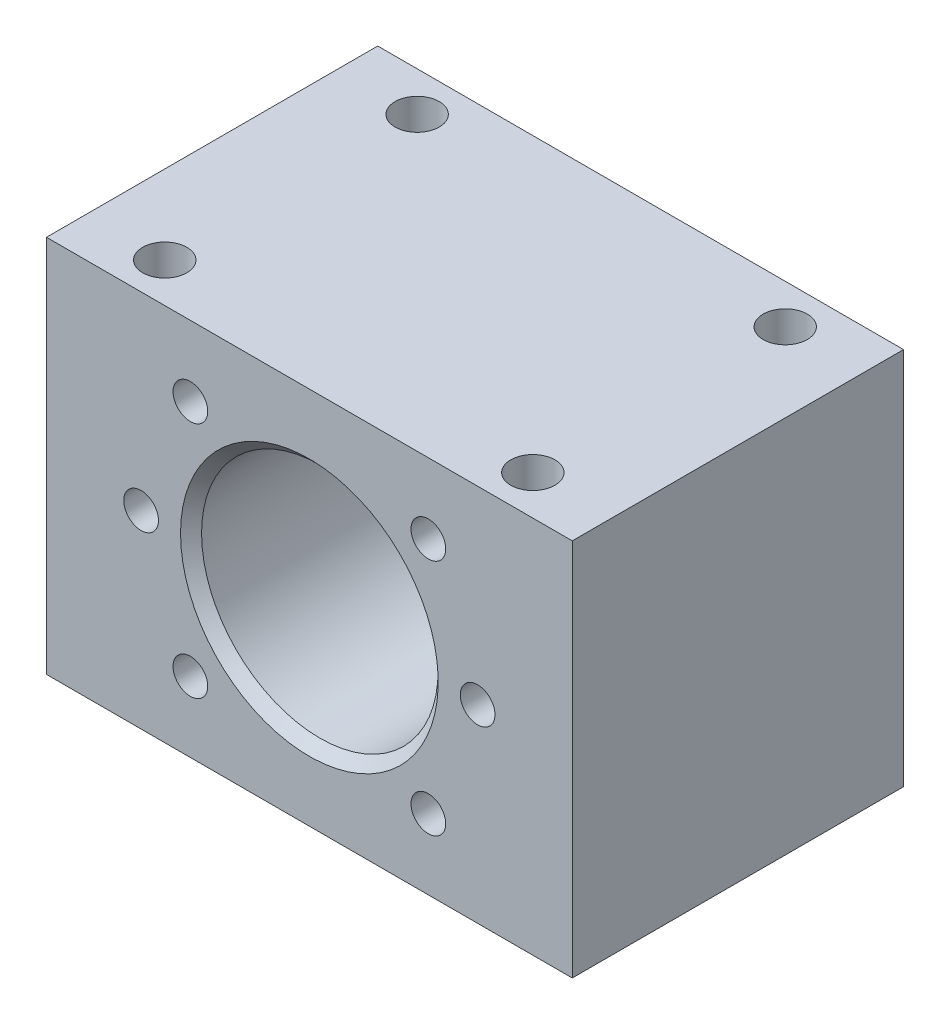
ISO-10303-21;
HEADER;
FILE_DESCRIPTION(('STEP AP214'),'2;1');
FILE_NAME('part.step','',(''),(''),'','','');
FILE_SCHEMA(('AUTOMOTIVE_DESIGN { 1 0 10303 214 1 1 1 1 }'));
ENDSEC;
DATA;
#1=APPLICATION_CONTEXT('core data for automotive mechanical design processes');
#2=APPLICATION_PROTOCOL_DEFINITION('international standard','automotive_design',2000,#1);
#3=PRODUCT_CONTEXT('',#1,'mechanical');
#4=PRODUCT('Part','Part','',(#3));
#5=PRODUCT_RELATED_PRODUCT_CATEGORY('part','',(#4));
#6=PRODUCT_DEFINITION_FORMATION('','',#4);
#7=PRODUCT_DEFINITION_CONTEXT('part definition',#1,'design');
#8=PRODUCT_DEFINITION('design','',#6,#7);
#9=PRODUCT_DEFINITION_SHAPE('','',#8);
#10=(LENGTH_UNIT() NAMED_UNIT(*) SI_UNIT(.MILLI.,.METRE.));
#11=(NAMED_UNIT(*) PLANE_ANGLE_UNIT() SI_UNIT($,.RADIAN.));
#12=(NAMED_UNIT(*) SI_UNIT($,.STERADIAN.) SOLID_ANGLE_UNIT());
#13=UNCERTAINTY_MEASURE_WITH_UNIT(LENGTH_MEASURE(1.E-05),#10,'distance_accuracy_value','');
#14=(GEOMETRIC_REPRESENTATION_CONTEXT(3) GLOBAL_UNCERTAINTY_ASSIGNED_CONTEXT((#13)) GLOBAL_UNIT_ASSIGNED_CONTEXT((#10,
#11,#12)) REPRESENTATION_CONTEXT('',''));
#15=CARTESIAN_POINT('',(0.,0.,0.));
#16=DIRECTION('',(0.,0.,1.));
#17=DIRECTION('',(1.,0.,0.));
#18=AXIS2_PLACEMENT_3D('',#15,#16,#17);
#19=CARTESIAN_POINT('',(25.,-18.,31.5));
#20=DIRECTION('',(-1.,0.,0.));
#21=DIRECTION('',(0.,0.,1.));
#22=AXIS2_PLACEMENT_3D('',#19,#20,#21);
#23=PLANE('',#22);
#24=DIRECTION('',(0.,1.,0.));
#25=VECTOR('',#24,1.);
#26=CARTESIAN_POINT('',(25.,-18.,0.));
#27=LINE('',#26,#25);
#28=CARTESIAN_POINT('',(25.,-18.,0.));
#29=VERTEX_POINT('',#28);
#30=CARTESIAN_POINT('',(25.,18.,0.));
#31=VERTEX_POINT('',#30);
#32=EDGE_CURVE('E185',#29,#31,#27,.T.);
#33=ORIENTED_EDGE('',*,*,#32,.T.);
#34=DIRECTION('',(0.,0.,-1.));
#35=VECTOR('',#34,1.);
#36=CARTESIAN_POINT('',(25.,18.,31.5));
#37=LINE('',#36,#35);
#38=CARTESIAN_POINT('',(25.,18.,31.5));
#39=VERTEX_POINT('',#38);
#40=EDGE_CURVE('E204',#39,#31,#37,.T.);
#41=ORIENTED_EDGE('',*,*,#40,.F.);
#42=DIRECTION('',(0.,1.,0.));
#43=VECTOR('',#42,1.);
#44=CARTESIAN_POINT('',(25.,-18.,31.5));
#45=LINE('',#44,#43);
#46=CARTESIAN_POINT('',(25.,-18.,31.5));
#47=VERTEX_POINT('',#46);
#48=EDGE_CURVE('E186',#47,#39,#45,.T.);
#49=ORIENTED_EDGE('',*,*,#48,.F.);
#50=DIRECTION('',(0.,0.,-1.));
#51=VECTOR('',#50,1.);
#52=CARTESIAN_POINT('',(25.,-18.,31.5));
#53=LINE('',#52,#51);
#54=EDGE_CURVE('E192',#47,#29,#53,.T.);
#55=ORIENTED_EDGE('',*,*,#54,.T.);
#56=EDGE_LOOP('',(#33,#41,#49,#55));
#57=FACE_BOUND('',#56,.T.);
#58=ADVANCED_FACE('F36',(#57),#23,.F.);
#59=CARTESIAN_POINT('',(-25.,18.,31.5));
#60=DIRECTION('',(0.,-1.,0.));
#61=DIRECTION('',(0.,0.,-1.));
#62=AXIS2_PLACEMENT_3D('',#59,#60,#61);
#63=PLANE('',#62);
#64=CARTESIAN_POINT('',(-17.5,18.,27.75));
#65=DIRECTION('',(0.,1.,0.));
#66=DIRECTION('',(0.,0.,1.));
#67=AXIS2_PLACEMENT_3D('',#64,#65,#66);
#68=CIRCLE('',#67,2.1);
#69=CARTESIAN_POINT('',(-17.5,18.,29.85));
#70=VERTEX_POINT('',#69);
#71=EDGE_CURVE('E127',#70,#70,#68,.T.);
#72=ORIENTED_EDGE('',*,*,#71,.F.);
#73=EDGE_LOOP('',(#72));
#74=FACE_BOUND('',#73,.T.);
#75=CARTESIAN_POINT('',(-17.5,18.,3.75));
#76=DIRECTION('',(0.,1.,0.));
#77=DIRECTION('',(0.,0.,1.));
#78=AXIS2_PLACEMENT_3D('',#75,#76,#77);
#79=CIRCLE('',#78,2.1);
#80=CARTESIAN_POINT('',(-17.5,18.,5.85));
#81=VERTEX_POINT('',#80);
#82=EDGE_CURVE('E126',#81,#81,#79,.T.);
#83=ORIENTED_EDGE('',*,*,#82,.F.);
#84=EDGE_LOOP('',(#83));
#85=FACE_BOUND('',#84,.T.);
#86=CARTESIAN_POINT('',(17.5,18.,3.75));
#87=DIRECTION('',(0.,1.,0.));
#88=DIRECTION('',(0.,0.,1.));
#89=AXIS2_PLACEMENT_3D('',#86,#87,#88);
#90=CIRCLE('',#89,2.1);
#91=CARTESIAN_POINT('',(17.5,18.,5.85));
#92=VERTEX_POINT('',#91);
#93=EDGE_CURVE('E137',#92,#92,#90,.T.);
#94=ORIENTED_EDGE('',*,*,#93,.F.);
#95=EDGE_LOOP('',(#94));
#96=FACE_BOUND('',#95,.T.);
#97=CARTESIAN_POINT('',(17.5,18.,27.75));
#98=DIRECTION('',(0.,1.,0.));
#99=DIRECTION('',(0.,0.,1.));
#100=AXIS2_PLACEMENT_3D('',#97,#98,#99);
#101=CIRCLE('',#100,2.1);
#102=CARTESIAN_POINT('',(17.5,18.,29.85));
#103=VERTEX_POINT('',#102);
#104=EDGE_CURVE('E143',#103,#103,#101,.T.);
#105=ORIENTED_EDGE('',*,*,#104,.F.);
#106=EDGE_LOOP('',(#105));
#107=FACE_BOUND('',#106,.T.);
#108=DIRECTION('',(-1.,0.,0.));
#109=VECTOR('',#108,1.);
#110=CARTESIAN_POINT('',(-25.,18.,0.));
#111=LINE('',#110,#109);
#112=CARTESIAN_POINT('',(-25.,18.,0.));
#113=VERTEX_POINT('',#112);
#114=EDGE_CURVE('E195',#31,#113,#111,.T.);
#115=ORIENTED_EDGE('',*,*,#114,.T.);
#116=DIRECTION('',(0.,0.,-1.));
#117=VECTOR('',#116,1.);
#118=CARTESIAN_POINT('',(-25.,18.,31.5));
#119=LINE('',#118,#117);
#120=CARTESIAN_POINT('',(-25.,18.,31.5));
#121=VERTEX_POINT('',#120);
#122=EDGE_CURVE('E202',#121,#113,#119,.T.);
#123=ORIENTED_EDGE('',*,*,#122,.F.);
#124=DIRECTION('',(-1.,0.,0.));
#125=VECTOR('',#124,1.);
#126=CARTESIAN_POINT('',(-25.,18.,31.5));
#127=LINE('',#126,#125);
#128=EDGE_CURVE('E85',#39,#121,#127,.T.);
#129=ORIENTED_EDGE('',*,*,#128,.F.);
#130=ORIENTED_EDGE('',*,*,#40,.T.);
#131=EDGE_LOOP('',(#115,#123,#129,#130));
#132=FACE_BOUND('',#131,.T.);
#133=ADVANCED_FACE('F234',(#74,#85,#96,#107,#132),#63,.F.);
#134=CARTESIAN_POINT('',(-25.,-18.,31.5));
#135=DIRECTION('',(1.,0.,0.));
#136=DIRECTION('',(0.,0.,-1.));
#137=AXIS2_PLACEMENT_3D('',#134,#135,#136);
#138=PLANE('',#137);
#139=DIRECTION('',(0.,-1.,0.));
#140=VECTOR('',#139,1.);
#141=CARTESIAN_POINT('',(-25.,-18.,0.));
#142=LINE('',#141,#140);
#143=CARTESIAN_POINT('',(-25.,-18.,0.));
#144=VERTEX_POINT('',#143);
#145=EDGE_CURVE('E71',#113,#144,#142,.T.);
#146=ORIENTED_EDGE('',*,*,#145,.T.);
#147=DIRECTION('',(0.,0.,-1.));
#148=VECTOR('',#147,1.);
#149=CARTESIAN_POINT('',(-25.,-18.,31.5));
#150=LINE('',#149,#148);
#151=CARTESIAN_POINT('',(-25.,-18.,31.5));
#152=VERTEX_POINT('',#151);
#153=EDGE_CURVE('E200',#152,#144,#150,.T.);
#154=ORIENTED_EDGE('',*,*,#153,.F.);
#155=DIRECTION('',(0.,-1.,0.));
#156=VECTOR('',#155,1.);
#157=CARTESIAN_POINT('',(-25.,-18.,31.5));
#158=LINE('',#157,#156);
#159=EDGE_CURVE('E189',#121,#152,#158,.T.);
#160=ORIENTED_EDGE('',*,*,#159,.F.);
#161=ORIENTED_EDGE('',*,*,#122,.T.);
#162=EDGE_LOOP('',(#146,#154,#160,#161));
#163=FACE_BOUND('',#162,.T.);
#164=ADVANCED_FACE('F233',(#163),#138,.F.);
#165=CARTESIAN_POINT('',(-25.,-18.,31.5));
#166=DIRECTION('',(0.,1.,0.));
#167=DIRECTION('',(0.,0.,1.));
#168=AXIS2_PLACEMENT_3D('',#165,#166,#167);
#169=PLANE('',#168);
#170=DIRECTION('',(1.,0.,0.));
#171=VECTOR('',#170,1.);
#172=CARTESIAN_POINT('',(-25.,-18.,0.));
#173=LINE('',#172,#171);
#174=EDGE_CURVE('E77',#144,#29,#173,.T.);
#175=ORIENTED_EDGE('',*,*,#174,.T.);
#176=ORIENTED_EDGE('',*,*,#54,.F.);
#177=DIRECTION('',(1.,0.,0.));
#178=VECTOR('',#177,1.);
#179=CARTESIAN_POINT('',(-25.,-18.,31.5));
#180=LINE('',#179,#178);
#181=EDGE_CURVE('E53',#152,#47,#180,.T.);
#182=ORIENTED_EDGE('',*,*,#181,.F.);
#183=ORIENTED_EDGE('',*,*,#153,.T.);
#184=EDGE_LOOP('',(#175,#176,#182,#183));
#185=FACE_BOUND('',#184,.T.);
#186=ADVANCED_FACE('F231',(#185),#169,.F.);
#187=CARTESIAN_POINT('',(0.,0.,31.5));
#188=DIRECTION('',(0.,0.,-1.));
#189=DIRECTION('',(-1.,0.,0.));
#190=AXIS2_PLACEMENT_3D('',#187,#188,#189);
#191=PLANE('',#190);
#192=CARTESIAN_POINT('',(0.,0.,31.5));
#193=DIRECTION('',(0.,0.,-1.));
#194=DIRECTION('',(-1.,0.,0.));
#195=AXIS2_PLACEMENT_3D('',#192,#193,#194);
#196=CIRCLE('',#195,12.25);
#197=CARTESIAN_POINT('',(-12.25,0.,31.5));
#198=VERTEX_POINT('',#197);
#199=EDGE_CURVE('E11',#198,#198,#196,.T.);
#200=ORIENTED_EDGE('',*,*,#199,.T.);
#201=EDGE_LOOP('',(#200));
#202=FACE_BOUND('',#201,.T.);
#203=CARTESIAN_POINT('',(-11.3137084989847,11.3137084989848,31.5));
#204=DIRECTION('',(0.,0.,1.));
#205=DIRECTION('',(1.,0.,0.));
#206=AXIS2_PLACEMENT_3D('',#203,#204,#205);
#207=CIRCLE('',#206,1.65);
#208=CARTESIAN_POINT('',(-9.66370849898474,11.3137084989848,31.5));
#209=VERTEX_POINT('',#208);
#210=EDGE_CURVE('E149',#209,#209,#207,.T.);
#211=ORIENTED_EDGE('',*,*,#210,.F.);
#212=EDGE_LOOP('',(#211));
#213=FACE_BOUND('',#212,.T.);
#214=CARTESIAN_POINT('',(-16.,0.,31.5));
#215=DIRECTION('',(0.,0.,1.));
#216=DIRECTION('',(1.,0.,0.));
#217=AXIS2_PLACEMENT_3D('',#214,#215,#216);
#218=CIRCLE('',#217,1.65);
#219=CARTESIAN_POINT('',(-14.35,0.,31.5));
#220=VERTEX_POINT('',#219);
#221=EDGE_CURVE('E155',#220,#220,#218,.T.);
#222=ORIENTED_EDGE('',*,*,#221,.F.);
#223=EDGE_LOOP('',(#222));
#224=FACE_BOUND('',#223,.T.);
#225=CARTESIAN_POINT('',(-11.3137084989847,-11.3137084989848,31.5));
#226=DIRECTION('',(0.,0.,1.));
#227=DIRECTION('',(1.,0.,0.));
#228=AXIS2_PLACEMENT_3D('',#225,#226,#227);
#229=CIRCLE('',#228,1.65);
#230=CARTESIAN_POINT('',(-9.66370849898474,-11.3137084989848,31.5));
#231=VERTEX_POINT('',#230);
#232=EDGE_CURVE('E161',#231,#231,#229,.T.);
#233=ORIENTED_EDGE('',*,*,#232,.F.);
#234=EDGE_LOOP('',(#233));
#235=FACE_BOUND('',#234,.T.);
#236=CARTESIAN_POINT('',(11.3137084989847,-11.3137084989848,31.5));
#237=DIRECTION('',(0.,0.,1.));
#238=DIRECTION('',(1.,0.,0.));
#239=AXIS2_PLACEMENT_3D('',#236,#237,#238);
#240=CIRCLE('',#239,1.65);
#241=CARTESIAN_POINT('',(12.9637084989847,-11.3137084989848,31.5));
#242=VERTEX_POINT('',#241);
#243=EDGE_CURVE('E167',#242,#242,#240,.T.);
#244=ORIENTED_EDGE('',*,*,#243,.F.);
#245=EDGE_LOOP('',(#244));
#246=FACE_BOUND('',#245,.T.);
#247=CARTESIAN_POINT('',(16.,0.,31.5));
#248=DIRECTION('',(0.,0.,1.));
#249=DIRECTION('',(1.,0.,0.));
#250=AXIS2_PLACEMENT_3D('',#247,#248,#249);
#251=CIRCLE('',#250,1.65);
#252=CARTESIAN_POINT('',(17.65,0.,31.5));
#253=VERTEX_POINT('',#252);
#254=EDGE_CURVE('E173',#253,#253,#251,.T.);
#255=ORIENTED_EDGE('',*,*,#254,.F.);
#256=EDGE_LOOP('',(#255));
#257=FACE_BOUND('',#256,.T.);
#258=CARTESIAN_POINT('',(11.3137084989847,11.3137084989848,31.5));
#259=DIRECTION('',(0.,0.,1.));
#260=DIRECTION('',(1.,0.,0.));
#261=AXIS2_PLACEMENT_3D('',#258,#259,#260);
#262=CIRCLE('',#261,1.65);
#263=CARTESIAN_POINT('',(12.9637084989847,11.3137084989848,31.5));
#264=VERTEX_POINT('',#263);
#265=EDGE_CURVE('E179',#264,#264,#262,.T.);
#266=ORIENTED_EDGE('',*,*,#265,.F.);
#267=EDGE_LOOP('',(#266));
#268=FACE_BOUND('',#267,.T.);
#269=ORIENTED_EDGE('',*,*,#48,.T.);
#270=ORIENTED_EDGE('',*,*,#128,.T.);
#271=ORIENTED_EDGE('',*,*,#159,.T.);
#272=ORIENTED_EDGE('',*,*,#181,.T.);
#273=EDGE_LOOP('',(#269,#270,#271,#272));
#274=FACE_BOUND('',#273,.T.);
#275=ADVANCED_FACE('F225',(#202,#213,#224,#235,#246,#257,#268,#274),#191,.F.);
#276=CARTESIAN_POINT('',(0.,0.,0.));
#277=DIRECTION('',(0.,0.,-1.));
#278=DIRECTION('',(-1.,0.,0.));
#279=AXIS2_PLACEMENT_3D('',#276,#277,#278);
#280=PLANE('',#279);
#281=CARTESIAN_POINT('',(0.,0.,0.));
#282=DIRECTION('',(0.,0.,-1.));
#283=DIRECTION('',(-1.,0.,0.));
#284=AXIS2_PLACEMENT_3D('',#281,#282,#283);
#285=CIRCLE('',#284,12.25);
#286=CARTESIAN_POINT('',(-12.25,0.,0.));
#287=VERTEX_POINT('',#286);
#288=EDGE_CURVE('E206',#287,#287,#285,.F.);
#289=ORIENTED_EDGE('',*,*,#288,.T.);
#290=EDGE_LOOP('',(#289));
#291=FACE_BOUND('',#290,.T.);
#292=ORIENTED_EDGE('',*,*,#32,.F.);
#293=ORIENTED_EDGE('',*,*,#174,.F.);
#294=ORIENTED_EDGE('',*,*,#145,.F.);
#295=ORIENTED_EDGE('',*,*,#114,.F.);
#296=EDGE_LOOP('',(#292,#293,#294,#295));
#297=FACE_BOUND('',#296,.T.);
#298=ADVANCED_FACE('F222',(#291,#297),#280,.T.);
#299=CARTESIAN_POINT('',(0.,0.,0.));
#300=DIRECTION('',(0.,0.,1.));
#301=DIRECTION('',(1.,0.,0.));
#302=AXIS2_PLACEMENT_3D('',#299,#300,#301);
#303=CYLINDRICAL_SURFACE('',#302,11.25);
#304=CARTESIAN_POINT('',(0.,0.,1.));
#305=DIRECTION('',(0.,0.,-1.));
#306=DIRECTION('',(-1.,0.,0.));
#307=AXIS2_PLACEMENT_3D('',#304,#305,#306);
#308=CIRCLE('',#307,11.25);
#309=CARTESIAN_POINT('',(-11.25,0.,1.));
#310=VERTEX_POINT('',#309);
#311=EDGE_CURVE('E45',#310,#310,#308,.T.);
#312=ORIENTED_EDGE('',*,*,#311,.T.);
#313=EDGE_LOOP('',(#312));
#314=FACE_BOUND('',#313,.T.);
#315=CARTESIAN_POINT('',(0.,0.,30.5));
#316=DIRECTION('',(0.,0.,-1.));
#317=DIRECTION('',(-1.,0.,0.));
#318=AXIS2_PLACEMENT_3D('',#315,#316,#317);
#319=CIRCLE('',#318,11.25);
#320=CARTESIAN_POINT('',(-11.25,0.,30.5));
#321=VERTEX_POINT('',#320);
#322=EDGE_CURVE('E209',#321,#321,#319,.F.);
#323=ORIENTED_EDGE('',*,*,#322,.T.);
#324=EDGE_LOOP('',(#323));
#325=FACE_BOUND('',#324,.T.);
#326=ADVANCED_FACE('F214',(#314,#325),#303,.F.);
#327=CARTESIAN_POINT('',(11.3137084989847,11.3137084989848,19.5));
#328=DIRECTION('',(0.,0.,1.));
#329=DIRECTION('',(1.,0.,0.));
#330=AXIS2_PLACEMENT_3D('',#327,#328,#329);
#331=CONICAL_SURFACE('',#330,1.65,1.02974425867665);
#332=CARTESIAN_POINT('',(11.3137084989847,11.3137084989848,18.5085799786045));
#333=VERTEX_POINT('',#332);
#334=VERTEX_LOOP('',#333);
#335=FACE_BOUND('',#334,.T.);
#336=CARTESIAN_POINT('',(11.3137084989847,11.3137084989848,19.5));
#337=DIRECTION('',(0.,0.,1.));
#338=DIRECTION('',(1.,0.,0.));
#339=AXIS2_PLACEMENT_3D('',#336,#337,#338);
#340=CIRCLE('',#339,1.65);
#341=CARTESIAN_POINT('',(12.9637084989847,11.3137084989848,19.5));
#342=VERTEX_POINT('',#341);
#343=EDGE_CURVE('E182',#342,#342,#340,.T.);
#344=ORIENTED_EDGE('',*,*,#343,.T.);
#345=EDGE_LOOP('',(#344));
#346=FACE_BOUND('',#345,.T.);
#347=ADVANCED_FACE('F254',(#335,#346),#331,.F.);
#348=CARTESIAN_POINT('',(11.3137084989847,11.3137084989848,31.5));
#349=DIRECTION('',(0.,0.,1.));
#350=DIRECTION('',(1.,0.,0.));
#351=AXIS2_PLACEMENT_3D('',#348,#349,#350);
#352=CYLINDRICAL_SURFACE('',#351,1.65);
#353=ORIENTED_EDGE('',*,*,#343,.F.);
#354=EDGE_LOOP('',(#353));
#355=FACE_BOUND('',#354,.T.);
#356=ORIENTED_EDGE('',*,*,#265,.T.);
#357=EDGE_LOOP('',(#356));
#358=FACE_BOUND('',#357,.T.);
#359=ADVANCED_FACE('F257',(#355,#358),#352,.F.);
#360=CARTESIAN_POINT('',(16.,0.,19.5));
#361=DIRECTION('',(0.,0.,1.));
#362=DIRECTION('',(1.,0.,0.));
#363=AXIS2_PLACEMENT_3D('',#360,#361,#362);
#364=CONICAL_SURFACE('',#363,1.65,1.02974425867665);
#365=CARTESIAN_POINT('',(16.,0.,18.5085799786045));
#366=VERTEX_POINT('',#365);
#367=VERTEX_LOOP('',#366);
#368=FACE_BOUND('',#367,.T.);
#369=CARTESIAN_POINT('',(16.,0.,19.5));
#370=DIRECTION('',(0.,0.,1.));
#371=DIRECTION('',(1.,0.,0.));
#372=AXIS2_PLACEMENT_3D('',#369,#370,#371);
#373=CIRCLE('',#372,1.65);
#374=CARTESIAN_POINT('',(17.65,0.,19.5));
#375=VERTEX_POINT('',#374);
#376=EDGE_CURVE('E176',#375,#375,#373,.T.);
#377=ORIENTED_EDGE('',*,*,#376,.T.);
#378=EDGE_LOOP('',(#377));
#379=FACE_BOUND('',#378,.T.);
#380=ADVANCED_FACE('F261',(#368,#379),#364,.F.);
#381=CARTESIAN_POINT('',(16.,0.,31.5));
#382=DIRECTION('',(0.,0.,1.));
#383=DIRECTION('',(1.,0.,0.));
#384=AXIS2_PLACEMENT_3D('',#381,#382,#383);
#385=CYLINDRICAL_SURFACE('',#384,1.65);
#386=ORIENTED_EDGE('',*,*,#376,.F.);
#387=EDGE_LOOP('',(#386));
#388=FACE_BOUND('',#387,.T.);
#389=ORIENTED_EDGE('',*,*,#254,.T.);
#390=EDGE_LOOP('',(#389));
#391=FACE_BOUND('',#390,.T.);
#392=ADVANCED_FACE('F265',(#388,#391),#385,.F.);
#393=CARTESIAN_POINT('',(11.3137084989847,-11.3137084989848,19.5));
#394=DIRECTION('',(0.,0.,1.));
#395=DIRECTION('',(1.,0.,0.));
#396=AXIS2_PLACEMENT_3D('',#393,#394,#395);
#397=CONICAL_SURFACE('',#396,1.65,1.02974425867665);
#398=CARTESIAN_POINT('',(11.3137084989847,-11.3137084989848,18.5085799786045));
#399=VERTEX_POINT('',#398);
#400=VERTEX_LOOP('',#399);
#401=FACE_BOUND('',#400,.T.);
#402=CARTESIAN_POINT('',(11.3137084989847,-11.3137084989848,19.5));
#403=DIRECTION('',(0.,0.,1.));
#404=DIRECTION('',(1.,0.,0.));
#405=AXIS2_PLACEMENT_3D('',#402,#403,#404);
#406=CIRCLE('',#405,1.65);
#407=CARTESIAN_POINT('',(12.9637084989847,-11.3137084989848,19.5));
#408=VERTEX_POINT('',#407);
#409=EDGE_CURVE('E170',#408,#408,#406,.T.);
#410=ORIENTED_EDGE('',*,*,#409,.T.);
#411=EDGE_LOOP('',(#410));
#412=FACE_BOUND('',#411,.T.);
#413=ADVANCED_FACE('F269',(#401,#412),#397,.F.);
#414=CARTESIAN_POINT('',(11.3137084989847,-11.3137084989848,31.5));
#415=DIRECTION('',(0.,0.,1.));
#416=DIRECTION('',(1.,0.,0.));
#417=AXIS2_PLACEMENT_3D('',#414,#415,#416);
#418=CYLINDRICAL_SURFACE('',#417,1.65);
#419=ORIENTED_EDGE('',*,*,#409,.F.);
#420=EDGE_LOOP('',(#419));
#421=FACE_BOUND('',#420,.T.);
#422=ORIENTED_EDGE('',*,*,#243,.T.);
#423=EDGE_LOOP('',(#422));
#424=FACE_BOUND('',#423,.T.);
#425=ADVANCED_FACE('F273',(#421,#424),#418,.F.);
#426=CARTESIAN_POINT('',(-11.3137084989847,-11.3137084989848,19.5));
#427=DIRECTION('',(0.,0.,1.));
#428=DIRECTION('',(1.,0.,0.));
#429=AXIS2_PLACEMENT_3D('',#426,#427,#428);
#430=CONICAL_SURFACE('',#429,1.65,1.02974425867665);
#431=CARTESIAN_POINT('',(-11.3137084989847,-11.3137084989848,18.5085799786045));
#432=VERTEX_POINT('',#431);
#433=VERTEX_LOOP('',#432);
#434=FACE_BOUND('',#433,.T.);
#435=CARTESIAN_POINT('',(-11.3137084989847,-11.3137084989848,19.5));
#436=DIRECTION('',(0.,0.,1.));
#437=DIRECTION('',(1.,0.,0.));
#438=AXIS2_PLACEMENT_3D('',#435,#436,#437);
#439=CIRCLE('',#438,1.65);
#440=CARTESIAN_POINT('',(-9.66370849898474,-11.3137084989848,19.5));
#441=VERTEX_POINT('',#440);
#442=EDGE_CURVE('E164',#441,#441,#439,.T.);
#443=ORIENTED_EDGE('',*,*,#442,.T.);
#444=EDGE_LOOP('',(#443));
#445=FACE_BOUND('',#444,.T.);
#446=ADVANCED_FACE('F277',(#434,#445),#430,.F.);
#447=CARTESIAN_POINT('',(-11.3137084989847,-11.3137084989848,31.5));
#448=DIRECTION('',(0.,0.,1.));
#449=DIRECTION('',(1.,0.,0.));
#450=AXIS2_PLACEMENT_3D('',#447,#448,#449);
#451=CYLINDRICAL_SURFACE('',#450,1.65);
#452=ORIENTED_EDGE('',*,*,#442,.F.);
#453=EDGE_LOOP('',(#452));
#454=FACE_BOUND('',#453,.T.);
#455=ORIENTED_EDGE('',*,*,#232,.T.);
#456=EDGE_LOOP('',(#455));
#457=FACE_BOUND('',#456,.T.);
#458=ADVANCED_FACE('F281',(#454,#457),#451,.F.);
#459=CARTESIAN_POINT('',(-16.,0.,19.5));
#460=DIRECTION('',(0.,0.,1.));
#461=DIRECTION('',(1.,0.,0.));
#462=AXIS2_PLACEMENT_3D('',#459,#460,#461);
#463=CONICAL_SURFACE('',#462,1.65,1.02974425867665);
#464=CARTESIAN_POINT('',(-16.,0.,18.5085799786045));
#465=VERTEX_POINT('',#464);
#466=VERTEX_LOOP('',#465);
#467=FACE_BOUND('',#466,.T.);
#468=CARTESIAN_POINT('',(-16.,0.,19.5));
#469=DIRECTION('',(0.,0.,1.));
#470=DIRECTION('',(1.,0.,0.));
#471=AXIS2_PLACEMENT_3D('',#468,#469,#470);
#472=CIRCLE('',#471,1.65);
#473=CARTESIAN_POINT('',(-14.35,0.,19.5));
#474=VERTEX_POINT('',#473);
#475=EDGE_CURVE('E158',#474,#474,#472,.T.);
#476=ORIENTED_EDGE('',*,*,#475,.T.);
#477=EDGE_LOOP('',(#476));
#478=FACE_BOUND('',#477,.T.);
#479=ADVANCED_FACE('F285',(#467,#478),#463,.F.);
#480=CARTESIAN_POINT('',(-16.,0.,31.5));
#481=DIRECTION('',(0.,0.,1.));
#482=DIRECTION('',(1.,0.,0.));
#483=AXIS2_PLACEMENT_3D('',#480,#481,#482);
#484=CYLINDRICAL_SURFACE('',#483,1.65);
#485=ORIENTED_EDGE('',*,*,#475,.F.);
#486=EDGE_LOOP('',(#485));
#487=FACE_BOUND('',#486,.T.);
#488=ORIENTED_EDGE('',*,*,#221,.T.);
#489=EDGE_LOOP('',(#488));
#490=FACE_BOUND('',#489,.T.);
#491=ADVANCED_FACE('F289',(#487,#490),#484,.F.);
#492=CARTESIAN_POINT('',(-11.3137084989847,11.3137084989848,19.5));
#493=DIRECTION('',(0.,0.,1.));
#494=DIRECTION('',(1.,0.,0.));
#495=AXIS2_PLACEMENT_3D('',#492,#493,#494);
#496=CONICAL_SURFACE('',#495,1.65,1.02974425867665);
#497=CARTESIAN_POINT('',(-11.3137084989847,11.3137084989848,18.5085799786045));
#498=VERTEX_POINT('',#497);
#499=VERTEX_LOOP('',#498);
#500=FACE_BOUND('',#499,.T.);
#501=CARTESIAN_POINT('',(-11.3137084989847,11.3137084989848,19.5));
#502=DIRECTION('',(0.,0.,1.));
#503=DIRECTION('',(1.,0.,0.));
#504=AXIS2_PLACEMENT_3D('',#501,#502,#503);
#505=CIRCLE('',#504,1.65);
#506=CARTESIAN_POINT('',(-9.66370849898474,11.3137084989848,19.5));
#507=VERTEX_POINT('',#506);
#508=EDGE_CURVE('E152',#507,#507,#505,.T.);
#509=ORIENTED_EDGE('',*,*,#508,.T.);
#510=EDGE_LOOP('',(#509));
#511=FACE_BOUND('',#510,.T.);
#512=ADVANCED_FACE('F293',(#500,#511),#496,.F.);
#513=CARTESIAN_POINT('',(-11.3137084989847,11.3137084989848,31.5));
#514=DIRECTION('',(0.,0.,1.));
#515=DIRECTION('',(1.,0.,0.));
#516=AXIS2_PLACEMENT_3D('',#513,#514,#515);
#517=CYLINDRICAL_SURFACE('',#516,1.65);
#518=ORIENTED_EDGE('',*,*,#508,.F.);
#519=EDGE_LOOP('',(#518));
#520=FACE_BOUND('',#519,.T.);
#521=ORIENTED_EDGE('',*,*,#210,.T.);
#522=EDGE_LOOP('',(#521));
#523=FACE_BOUND('',#522,.T.);
#524=ADVANCED_FACE('F297',(#520,#523),#517,.F.);
#525=CARTESIAN_POINT('',(17.5,4.,27.75));
#526=DIRECTION('',(0.,1.,0.));
#527=DIRECTION('',(0.,0.,1.));
#528=AXIS2_PLACEMENT_3D('',#525,#526,#527);
#529=CONICAL_SURFACE('',#528,2.1,1.02974425867665);
#530=CARTESIAN_POINT('',(17.5,2.73819270004212,27.75));
#531=VERTEX_POINT('',#530);
#532=VERTEX_LOOP('',#531);
#533=FACE_BOUND('',#532,.T.);
#534=CARTESIAN_POINT('',(17.5,4.,27.75));
#535=DIRECTION('',(0.,1.,0.));
#536=DIRECTION('',(0.,0.,1.));
#537=AXIS2_PLACEMENT_3D('',#534,#535,#536);
#538=CIRCLE('',#537,2.1);
#539=CARTESIAN_POINT('',(17.5,4.,29.85));
#540=VERTEX_POINT('',#539);
#541=EDGE_CURVE('E146',#540,#540,#538,.T.);
#542=ORIENTED_EDGE('',*,*,#541,.T.);
#543=EDGE_LOOP('',(#542));
#544=FACE_BOUND('',#543,.T.);
#545=ADVANCED_FACE('F301',(#533,#544),#529,.F.);
#546=CARTESIAN_POINT('',(17.5,18.,27.75));
#547=DIRECTION('',(0.,1.,0.));
#548=DIRECTION('',(0.,0.,1.));
#549=AXIS2_PLACEMENT_3D('',#546,#547,#548);
#550=CYLINDRICAL_SURFACE('',#549,2.1);
#551=ORIENTED_EDGE('',*,*,#541,.F.);
#552=EDGE_LOOP('',(#551));
#553=FACE_BOUND('',#552,.T.);
#554=ORIENTED_EDGE('',*,*,#104,.T.);
#555=EDGE_LOOP('',(#554));
#556=FACE_BOUND('',#555,.T.);
#557=ADVANCED_FACE('F305',(#553,#556),#550,.F.);
#558=CARTESIAN_POINT('',(17.5,4.,3.75));
#559=DIRECTION('',(0.,1.,0.));
#560=DIRECTION('',(0.,0.,1.));
#561=AXIS2_PLACEMENT_3D('',#558,#559,#560);
#562=CONICAL_SURFACE('',#561,2.1,1.02974425867665);
#563=CARTESIAN_POINT('',(17.5,2.73819270004212,3.75));
#564=VERTEX_POINT('',#563);
#565=VERTEX_LOOP('',#564);
#566=FACE_BOUND('',#565,.T.);
#567=CARTESIAN_POINT('',(17.5,4.,3.75));
#568=DIRECTION('',(0.,1.,0.));
#569=DIRECTION('',(0.,0.,1.));
#570=AXIS2_PLACEMENT_3D('',#567,#568,#569);
#571=CIRCLE('',#570,2.1);
#572=CARTESIAN_POINT('',(17.5,4.,5.85));
#573=VERTEX_POINT('',#572);
#574=EDGE_CURVE('E140',#573,#573,#571,.T.);
#575=ORIENTED_EDGE('',*,*,#574,.T.);
#576=EDGE_LOOP('',(#575));
#577=FACE_BOUND('',#576,.T.);
#578=ADVANCED_FACE('F309',(#566,#577),#562,.F.);
#579=CARTESIAN_POINT('',(17.5,18.,3.75));
#580=DIRECTION('',(0.,1.,0.));
#581=DIRECTION('',(0.,0.,1.));
#582=AXIS2_PLACEMENT_3D('',#579,#580,#581);
#583=CYLINDRICAL_SURFACE('',#582,2.1);
#584=ORIENTED_EDGE('',*,*,#574,.F.);
#585=EDGE_LOOP('',(#584));
#586=FACE_BOUND('',#585,.T.);
#587=ORIENTED_EDGE('',*,*,#93,.T.);
#588=EDGE_LOOP('',(#587));
#589=FACE_BOUND('',#588,.T.);
#590=ADVANCED_FACE('F313',(#586,#589),#583,.F.);
#591=CARTESIAN_POINT('',(-17.5,4.,3.75));
#592=DIRECTION('',(0.,1.,0.));
#593=DIRECTION('',(0.,0.,1.));
#594=AXIS2_PLACEMENT_3D('',#591,#592,#593);
#595=CONICAL_SURFACE('',#594,2.1,1.02974425867665);
#596=CARTESIAN_POINT('',(-17.5,2.73819270004212,3.75));
#597=VERTEX_POINT('',#596);
#598=VERTEX_LOOP('',#597);
#599=FACE_BOUND('',#598,.T.);
#600=CARTESIAN_POINT('',(-17.5,4.,3.75));
#601=DIRECTION('',(0.,1.,0.));
#602=DIRECTION('',(0.,0.,1.));
#603=AXIS2_PLACEMENT_3D('',#600,#601,#602);
#604=CIRCLE('',#603,2.1);
#605=CARTESIAN_POINT('',(-17.5,4.,5.85));
#606=VERTEX_POINT('',#605);
#607=EDGE_CURVE('E130',#606,#606,#604,.T.);
#608=ORIENTED_EDGE('',*,*,#607,.T.);
#609=EDGE_LOOP('',(#608));
#610=FACE_BOUND('',#609,.T.);
#611=ADVANCED_FACE('F317',(#599,#610),#595,.F.);
#612=CARTESIAN_POINT('',(-17.5,18.,3.75));
#613=DIRECTION('',(0.,1.,0.));
#614=DIRECTION('',(0.,0.,1.));
#615=AXIS2_PLACEMENT_3D('',#612,#613,#614);
#616=CYLINDRICAL_SURFACE('',#615,2.1);
#617=ORIENTED_EDGE('',*,*,#607,.F.);
#618=EDGE_LOOP('',(#617));
#619=FACE_BOUND('',#618,.T.);
#620=ORIENTED_EDGE('',*,*,#82,.T.);
#621=EDGE_LOOP('',(#620));
#622=FACE_BOUND('',#621,.T.);
#623=ADVANCED_FACE('F120',(#619,#622),#616,.F.);
#624=CARTESIAN_POINT('',(-17.5,4.,27.75));
#625=DIRECTION('',(0.,1.,0.));
#626=DIRECTION('',(0.,0.,1.));
#627=AXIS2_PLACEMENT_3D('',#624,#625,#626);
#628=CONICAL_SURFACE('',#627,2.1,1.02974425867665);
#629=CARTESIAN_POINT('',(-17.5,2.73819270004212,27.75));
#630=VERTEX_POINT('',#629);
#631=VERTEX_LOOP('',#630);
#632=FACE_BOUND('',#631,.T.);
#633=CARTESIAN_POINT('',(-17.5,4.,27.75));
#634=DIRECTION('',(0.,1.,0.));
#635=DIRECTION('',(0.,0.,1.));
#636=AXIS2_PLACEMENT_3D('',#633,#634,#635);
#637=CIRCLE('',#636,2.1);
#638=CARTESIAN_POINT('',(-17.5,4.,29.85));
#639=VERTEX_POINT('',#638);
#640=EDGE_CURVE('E124',#639,#639,#637,.T.);
#641=ORIENTED_EDGE('',*,*,#640,.T.);
#642=EDGE_LOOP('',(#641));
#643=FACE_BOUND('',#642,.T.);
#644=ADVANCED_FACE('F116',(#632,#643),#628,.F.);
#645=CARTESIAN_POINT('',(-17.5,18.,27.75));
#646=DIRECTION('',(0.,1.,0.));
#647=DIRECTION('',(0.,0.,1.));
#648=AXIS2_PLACEMENT_3D('',#645,#646,#647);
#649=CYLINDRICAL_SURFACE('',#648,2.1);
#650=ORIENTED_EDGE('',*,*,#640,.F.);
#651=EDGE_LOOP('',(#650));
#652=FACE_BOUND('',#651,.T.);
#653=ORIENTED_EDGE('',*,*,#71,.T.);
#654=EDGE_LOOP('',(#653));
#655=FACE_BOUND('',#654,.T.);
#656=ADVANCED_FACE('F119',(#652,#655),#649,.F.);
#657=CARTESIAN_POINT('',(0.,0.,0.));
#658=DIRECTION('',(0.,0.,-1.));
#659=DIRECTION('',(-1.,0.,0.));
#660=AXIS2_PLACEMENT_3D('',#657,#658,#659);
#661=CONICAL_SURFACE('',#660,12.25,0.785398163397447);
#662=ORIENTED_EDGE('',*,*,#311,.F.);
#663=EDGE_LOOP('',(#662));
#664=FACE_BOUND('',#663,.T.);
#665=ORIENTED_EDGE('',*,*,#288,.F.);
#666=EDGE_LOOP('',(#665));
#667=FACE_BOUND('',#666,.T.);
#668=ADVANCED_FACE('F217',(#664,#667),#661,.F.);
#669=CARTESIAN_POINT('',(0.,0.,30.5));
#670=DIRECTION('',(0.,0.,1.));
#671=DIRECTION('',(1.,0.,0.));
#672=AXIS2_PLACEMENT_3D('',#669,#670,#671);
#673=CONICAL_SURFACE('',#672,11.25,0.785398163397456);
#674=ORIENTED_EDGE('',*,*,#199,.F.);
#675=EDGE_LOOP('',(#674));
#676=FACE_BOUND('',#675,.T.);
#677=ORIENTED_EDGE('',*,*,#322,.F.);
#678=EDGE_LOOP('',(#677));
#679=FACE_BOUND('',#678,.T.);
#680=ADVANCED_FACE('F38',(#676,#679),#673,.F.);
#681=CLOSED_SHELL('',(#58,#133,#164,#186,#275,#298,#326,#347,#359,#380,#392,#413,#425,#446,#458,
#479,#491,#512,#524,#545,#557,#578,#590,#611,#623,#644,#656,#668,#680));
#682=MANIFOLD_SOLID_BREP('B2',#681);
#683=ADVANCED_BREP_SHAPE_REPRESENTATION('',(#18,#682),#14);
#684=SHAPE_DEFINITION_REPRESENTATION(#9,#683);
ENDSEC;
END-ISO-10303-21;
